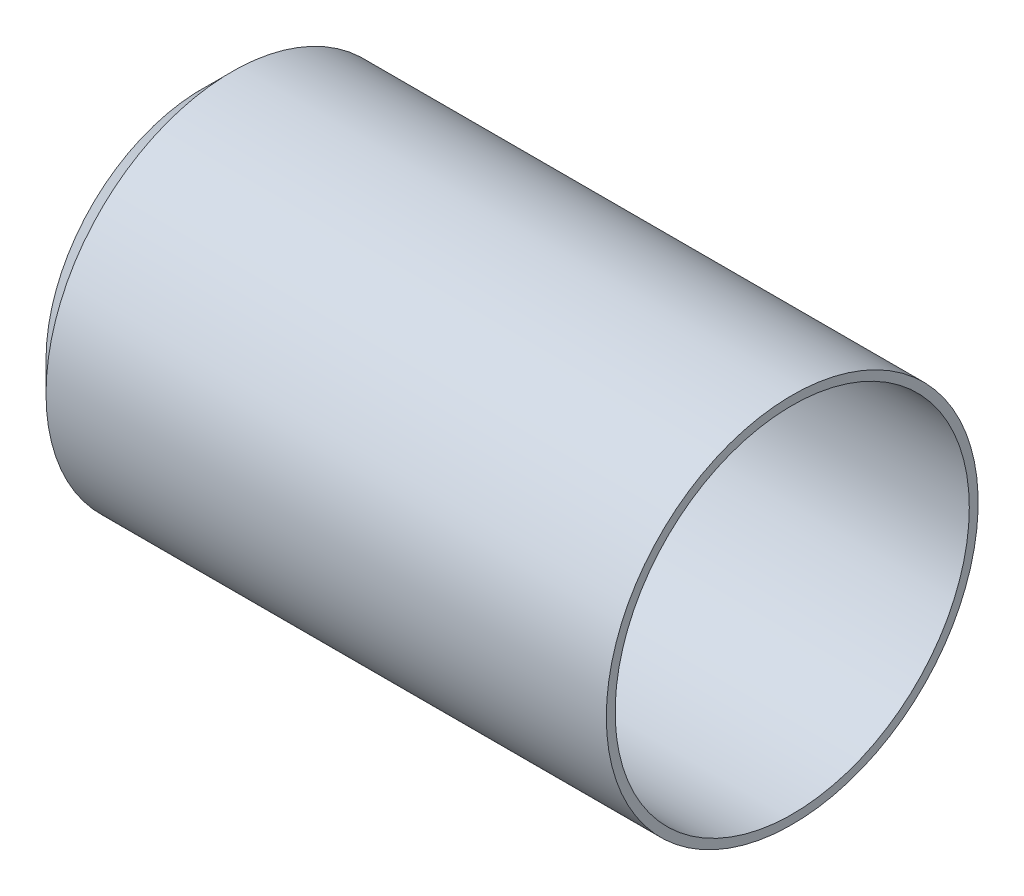
ISO-10303-21;
HEADER;
FILE_DESCRIPTION(('STEP AP214'),'2;1');
FILE_NAME('part.step','',(''),(''),'','','');
FILE_SCHEMA(('AUTOMOTIVE_DESIGN { 1 0 10303 214 1 1 1 1 }'));
ENDSEC;
DATA;
#1=APPLICATION_CONTEXT('core data for automotive mechanical design processes');
#2=APPLICATION_PROTOCOL_DEFINITION('international standard','automotive_design',2000,#1);
#3=PRODUCT_CONTEXT('',#1,'mechanical');
#4=PRODUCT('Part','Part','',(#3));
#5=PRODUCT_RELATED_PRODUCT_CATEGORY('part','',(#4));
#6=PRODUCT_DEFINITION_FORMATION('','',#4);
#7=PRODUCT_DEFINITION_CONTEXT('part definition',#1,'design');
#8=PRODUCT_DEFINITION('design','',#6,#7);
#9=PRODUCT_DEFINITION_SHAPE('','',#8);
#10=(LENGTH_UNIT() NAMED_UNIT(*) SI_UNIT(.MILLI.,.METRE.));
#11=(NAMED_UNIT(*) PLANE_ANGLE_UNIT() SI_UNIT($,.RADIAN.));
#12=(NAMED_UNIT(*) SI_UNIT($,.STERADIAN.) SOLID_ANGLE_UNIT());
#13=UNCERTAINTY_MEASURE_WITH_UNIT(LENGTH_MEASURE(1.E-05),#10,'distance_accuracy_value','');
#14=(GEOMETRIC_REPRESENTATION_CONTEXT(3) GLOBAL_UNCERTAINTY_ASSIGNED_CONTEXT((#13)) GLOBAL_UNIT_ASSIGNED_CONTEXT((#10,
#11,#12)) REPRESENTATION_CONTEXT('',''));
#15=CARTESIAN_POINT('',(0.,0.,0.));
#16=DIRECTION('',(0.,0.,1.));
#17=DIRECTION('',(1.,0.,0.));
#18=AXIS2_PLACEMENT_3D('',#15,#16,#17);
#19=CARTESIAN_POINT('',(100.,0.,0.));
#20=DIRECTION('',(-1.,0.,0.));
#21=DIRECTION('',(0.,0.,1.));
#22=AXIS2_PLACEMENT_3D('',#19,#20,#21);
#23=CYLINDRICAL_SURFACE('',#22,31.525);
#24=CARTESIAN_POINT('',(5.00000000000012,0.,0.));
#25=DIRECTION('',(1.,0.,0.));
#26=DIRECTION('',(0.,0.,-1.));
#27=AXIS2_PLACEMENT_3D('',#24,#25,#26);
#28=CIRCLE('',#27,31.525);
#29=CARTESIAN_POINT('',(5.00000000000012,0.,31.525));
#30=VERTEX_POINT('',#29);
#31=EDGE_CURVE('E46',#30,#30,#28,.T.);
#32=CARTESIAN_POINT('',(100.,0.,0.));
#33=DIRECTION('',(1.,0.,0.));
#34=DIRECTION('',(0.,0.,-1.));
#35=AXIS2_PLACEMENT_3D('',#32,#33,#34);
#36=CIRCLE('',#35,31.525);
#37=CARTESIAN_POINT('',(100.,0.,31.525));
#38=VERTEX_POINT('',#37);
#39=EDGE_CURVE('E50',#38,#38,#36,.T.);
#40=CARTESIAN_POINT('',(5.00000000000012,0.,31.525));
#41=CARTESIAN_POINT('',(5.98958333333345,0.,31.525));
#42=CARTESIAN_POINT('',(6.97916666666678,0.,31.525));
#43=CARTESIAN_POINT('',(8.95833333333344,0.,31.525));
#44=CARTESIAN_POINT('',(9.94791666666678,0.,31.525));
#45=CARTESIAN_POINT('',(11.9270833333334,0.,31.525));
#46=CARTESIAN_POINT('',(12.9166666666668,0.,31.525));
#47=CARTESIAN_POINT('',(14.8958333333334,0.,31.525));
#48=CARTESIAN_POINT('',(15.8854166666668,0.,31.525));
#49=CARTESIAN_POINT('',(17.8645833333334,0.,31.525));
#50=CARTESIAN_POINT('',(18.8541666666668,0.,31.525));
#51=CARTESIAN_POINT('',(20.8333333333334,0.,31.525));
#52=CARTESIAN_POINT('',(21.8229166666668,0.,31.525));
#53=CARTESIAN_POINT('',(23.8020833333334,0.,31.525));
#54=CARTESIAN_POINT('',(24.7916666666668,0.,31.525));
#55=CARTESIAN_POINT('',(26.7708333333334,0.,31.525));
#56=CARTESIAN_POINT('',(27.7604166666667,0.,31.525));
#57=CARTESIAN_POINT('',(29.7395833333334,0.,31.525));
#58=CARTESIAN_POINT('',(30.7291666666668,0.,31.525));
#59=CARTESIAN_POINT('',(32.7083333333334,0.,31.525));
#60=CARTESIAN_POINT('',(33.6979166666667,0.,31.525));
#61=CARTESIAN_POINT('',(35.6770833333334,0.,31.525));
#62=CARTESIAN_POINT('',(36.6666666666667,0.,31.525));
#63=CARTESIAN_POINT('',(38.6458333333334,0.,31.525));
#64=CARTESIAN_POINT('',(39.6354166666667,0.,31.525));
#65=CARTESIAN_POINT('',(41.6145833333334,0.,31.525));
#66=CARTESIAN_POINT('',(42.6041666666667,0.,31.525));
#67=CARTESIAN_POINT('',(44.5833333333334,0.,31.525));
#68=CARTESIAN_POINT('',(45.5729166666667,0.,31.525));
#69=CARTESIAN_POINT('',(47.5520833333334,0.,31.525));
#70=CARTESIAN_POINT('',(48.5416666666667,0.,31.525));
#71=CARTESIAN_POINT('',(50.5208333333334,0.,31.525));
#72=CARTESIAN_POINT('',(51.5104166666667,0.,31.525));
#73=CARTESIAN_POINT('',(53.4895833333334,0.,31.525));
#74=CARTESIAN_POINT('',(54.4791666666667,0.,31.525));
#75=CARTESIAN_POINT('',(56.4583333333334,0.,31.525));
#76=CARTESIAN_POINT('',(57.4479166666667,0.,31.525));
#77=CARTESIAN_POINT('',(59.4270833333334,0.,31.525));
#78=CARTESIAN_POINT('',(60.4166666666667,0.,31.525));
#79=CARTESIAN_POINT('',(62.3958333333334,0.,31.525));
#80=CARTESIAN_POINT('',(63.3854166666667,0.,31.525));
#81=CARTESIAN_POINT('',(65.3645833333334,0.,31.525));
#82=CARTESIAN_POINT('',(66.3541666666667,0.,31.525));
#83=CARTESIAN_POINT('',(68.3333333333334,0.,31.525));
#84=CARTESIAN_POINT('',(69.3229166666667,0.,31.525));
#85=CARTESIAN_POINT('',(71.3020833333334,0.,31.525));
#86=CARTESIAN_POINT('',(72.2916666666667,0.,31.525));
#87=CARTESIAN_POINT('',(74.2708333333334,0.,31.525));
#88=CARTESIAN_POINT('',(75.2604166666667,0.,31.525));
#89=CARTESIAN_POINT('',(77.2395833333334,0.,31.525));
#90=CARTESIAN_POINT('',(78.2291666666667,0.,31.525));
#91=CARTESIAN_POINT('',(80.2083333333334,0.,31.525));
#92=CARTESIAN_POINT('',(81.1979166666667,0.,31.525));
#93=CARTESIAN_POINT('',(83.1770833333333,0.,31.525));
#94=CARTESIAN_POINT('',(84.1666666666667,0.,31.525));
#95=CARTESIAN_POINT('',(86.1458333333333,0.,31.525));
#96=CARTESIAN_POINT('',(87.1354166666667,0.,31.525));
#97=CARTESIAN_POINT('',(89.1145833333333,0.,31.525));
#98=CARTESIAN_POINT('',(90.1041666666667,0.,31.525));
#99=CARTESIAN_POINT('',(92.0833333333333,0.,31.525));
#100=CARTESIAN_POINT('',(93.0729166666667,0.,31.525));
#101=CARTESIAN_POINT('',(95.0520833333333,0.,31.525));
#102=CARTESIAN_POINT('',(96.0416666666667,0.,31.525));
#103=CARTESIAN_POINT('',(98.0208333333333,0.,31.525));
#104=CARTESIAN_POINT('',(99.0104166666667,0.,31.525));
#105=CARTESIAN_POINT('',(100.,0.,31.525));
#106=B_SPLINE_CURVE_WITH_KNOTS('',3,(#40,#41,#42,#43,#44,#45,#46,#47,#48,#49,#50,#51,#52,#53,
#54,#55,#56,#57,#58,#59,#60,#61,#62,#63,#64,#65,#66,#67,#68,#69,#70,#71,#72,#73,#74,#75,#76,#77,
#78,#79,#80,#81,#82,#83,#84,#85,#86,#87,#88,#89,#90,#91,#92,#93,#94,#95,#96,#97,#98,#99,#100,
#101,#102,#103,#104,#105),.UNSPECIFIED.,.F.,.F.,(4,2,2,2,2,2,2,2,2,2,2,2,2,2,2,2,2,2,2,2,2,2,2,
2,2,2,2,2,2,2,2,2,4),(0.,2.96874999999999,5.9375,8.90624999999999,11.875,14.84375,17.8125,
20.78125,23.75,26.71875,29.6875,32.65625,35.625,38.59375,41.5624999999999,44.5312499999999,
47.4999999999999,50.4687499999999,53.4374999999999,56.4062499999999,59.3749999999999,
62.3437499999999,65.3124999999999,68.2812499999999,71.2499999999999,74.2187499999999,
77.1874999999999,80.1562499999999,83.1249999999999,86.0937499999999,89.0624999999999,
92.0312499999999,94.9999999999999),.UNSPECIFIED.);
#107=EDGE_CURVE('BSEAM38',#30,#38,#106,.T.);
#108=ORIENTED_EDGE('',*,*,#31,.T.);
#109=ORIENTED_EDGE('',*,*,#39,.F.);
#110=ORIENTED_EDGE('',*,*,#107,.T.);
#111=ORIENTED_EDGE('',*,*,#107,.F.);
#112=EDGE_LOOP('',(#108,#110,#109,#111));
#113=FACE_BOUND('',#112,.T.);
#114=ADVANCED_FACE('F38',(#113),#23,.T.);
#115=CARTESIAN_POINT('',(100.,0.,0.));
#116=DIRECTION('',(1.,0.,0.));
#117=DIRECTION('',(0.,0.,-1.));
#118=AXIS2_PLACEMENT_3D('',#115,#116,#117);
#119=PLANE('',#118);
#120=CARTESIAN_POINT('',(100.,0.,0.));
#121=DIRECTION('',(1.,0.,0.));
#122=DIRECTION('',(0.,0.,-1.));
#123=AXIS2_PLACEMENT_3D('',#120,#121,#122);
#124=CIRCLE('',#123,30.025);
#125=CARTESIAN_POINT('',(100.,0.,-30.025));
#126=VERTEX_POINT('',#125);
#127=EDGE_CURVE('E57',#126,#126,#124,.T.);
#128=ORIENTED_EDGE('',*,*,#127,.F.);
#129=EDGE_LOOP('',(#128));
#130=FACE_BOUND('',#129,.T.);
#131=ORIENTED_EDGE('',*,*,#39,.T.);
#132=EDGE_LOOP('',(#131));
#133=FACE_BOUND('',#132,.T.);
#134=ADVANCED_FACE('F72',(#130,#133),#119,.T.);
#135=CARTESIAN_POINT('',(0.,0.,0.));
#136=DIRECTION('',(1.,0.,0.));
#137=DIRECTION('',(0.,0.,-1.));
#138=AXIS2_PLACEMENT_3D('',#135,#136,#137);
#139=PLANE('',#138);
#140=CARTESIAN_POINT('',(0.,0.,0.));
#141=DIRECTION('',(1.,0.,0.));
#142=DIRECTION('',(0.,0.,-1.));
#143=AXIS2_PLACEMENT_3D('',#140,#141,#142);
#144=CIRCLE('',#143,26.5249999999999);
#145=CARTESIAN_POINT('',(0.,0.,-26.5249999999999));
#146=VERTEX_POINT('',#145);
#147=EDGE_CURVE('E10',#146,#146,#144,.F.);
#148=ORIENTED_EDGE('',*,*,#147,.T.);
#149=EDGE_LOOP('',(#148));
#150=FACE_BOUND('',#149,.T.);
#151=ADVANCED_FACE('F68',(#150),#139,.F.);
#152=CARTESIAN_POINT('',(4.99999999999999,0.,0.));
#153=DIRECTION('',(1.,0.,0.));
#154=DIRECTION('',(0.,0.,-1.));
#155=AXIS2_PLACEMENT_3D('',#152,#153,#154);
#156=CYLINDRICAL_SURFACE('',#155,30.025);
#157=CARTESIAN_POINT('',(4.99999999999999,0.,0.));
#158=DIRECTION('',(1.,0.,0.));
#159=DIRECTION('',(0.,0.,-1.));
#160=AXIS2_PLACEMENT_3D('',#157,#158,#159);
#161=CIRCLE('',#160,30.025);
#162=CARTESIAN_POINT('',(4.99999999999999,0.,-30.025));
#163=VERTEX_POINT('',#162);
#164=EDGE_CURVE('E54',#163,#163,#161,.T.);
#165=ORIENTED_EDGE('',*,*,#164,.F.);
#166=EDGE_LOOP('',(#165));
#167=FACE_BOUND('',#166,.T.);
#168=ORIENTED_EDGE('',*,*,#127,.T.);
#169=EDGE_LOOP('',(#168));
#170=FACE_BOUND('',#169,.T.);
#171=ADVANCED_FACE('F65',(#167,#170),#156,.F.);
#172=CARTESIAN_POINT('',(4.99999999999999,0.,0.));
#173=DIRECTION('',(1.,0.,0.));
#174=DIRECTION('',(0.,0.,-1.));
#175=AXIS2_PLACEMENT_3D('',#172,#173,#174);
#176=PLANE('',#175);
#177=ORIENTED_EDGE('',*,*,#164,.T.);
#178=EDGE_LOOP('',(#177));
#179=FACE_BOUND('',#178,.T.);
#180=ADVANCED_FACE('F63',(#179),#176,.T.);
#181=CARTESIAN_POINT('',(5.00000000000012,0.,0.));
#182=DIRECTION('',(1.,0.,0.));
#183=DIRECTION('',(0.,0.,-1.));
#184=AXIS2_PLACEMENT_3D('',#181,#182,#183);
#185=CONICAL_SURFACE('',#184,31.525,0.78539816339745);
#186=ORIENTED_EDGE('',*,*,#147,.F.);
#187=EDGE_LOOP('',(#186));
#188=FACE_BOUND('',#187,.T.);
#189=ORIENTED_EDGE('',*,*,#31,.F.);
#190=EDGE_LOOP('',(#189));
#191=FACE_BOUND('',#190,.T.);
#192=ADVANCED_FACE('F41',(#188,#191),#185,.T.);
#193=CLOSED_SHELL('',(#114,#134,#151,#171,#180,#192));
#194=MANIFOLD_SOLID_BREP('B2',#193);
#195=ADVANCED_BREP_SHAPE_REPRESENTATION('',(#18,#194),#14);
#196=SHAPE_DEFINITION_REPRESENTATION(#9,#195);
ENDSEC;
END-ISO-10303-21;
